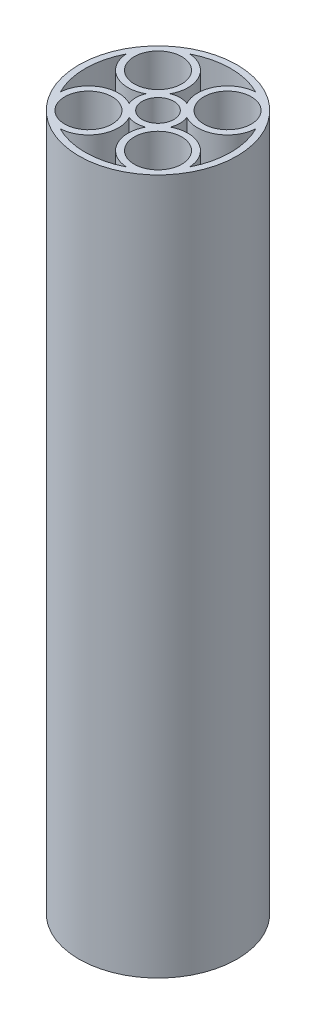
ISO-10303-21;
HEADER;
FILE_DESCRIPTION(('STEP AP214'),'2;1');
FILE_NAME('part.step','',(''),(''),'','','');
FILE_SCHEMA(('AUTOMOTIVE_DESIGN { 1 0 10303 214 1 1 1 1 }'));
ENDSEC;
DATA;
#1=APPLICATION_CONTEXT('core data for automotive mechanical design processes');
#2=APPLICATION_PROTOCOL_DEFINITION('international standard','automotive_design',2000,#1);
#3=PRODUCT_CONTEXT('',#1,'mechanical');
#4=PRODUCT('Part','Part','',(#3));
#5=PRODUCT_RELATED_PRODUCT_CATEGORY('part','',(#4));
#6=PRODUCT_DEFINITION_FORMATION('','',#4);
#7=PRODUCT_DEFINITION_CONTEXT('part definition',#1,'design');
#8=PRODUCT_DEFINITION('design','',#6,#7);
#9=PRODUCT_DEFINITION_SHAPE('','',#8);
#10=(LENGTH_UNIT() NAMED_UNIT(*) SI_UNIT(.MILLI.,.METRE.));
#11=(NAMED_UNIT(*) PLANE_ANGLE_UNIT() SI_UNIT($,.RADIAN.));
#12=(NAMED_UNIT(*) SI_UNIT($,.STERADIAN.) SOLID_ANGLE_UNIT());
#13=UNCERTAINTY_MEASURE_WITH_UNIT(LENGTH_MEASURE(1.E-05),#10,'distance_accuracy_value','');
#14=(GEOMETRIC_REPRESENTATION_CONTEXT(3) GLOBAL_UNCERTAINTY_ASSIGNED_CONTEXT((#13)) GLOBAL_UNIT_ASSIGNED_CONTEXT((#10,
#11,#12)) REPRESENTATION_CONTEXT('',''));
#15=CARTESIAN_POINT('',(0.,0.,0.));
#16=DIRECTION('',(0.,0.,1.));
#17=DIRECTION('',(1.,0.,0.));
#18=AXIS2_PLACEMENT_3D('',#15,#16,#17);
#19=CARTESIAN_POINT('',(0.,0.,0.));
#20=DIRECTION('',(0.,1.,0.));
#21=DIRECTION('',(0.,0.,1.));
#22=AXIS2_PLACEMENT_3D('',#19,#20,#21);
#23=PLANE('',#22);
#24=CARTESIAN_POINT('',(0.,0.,0.));
#25=DIRECTION('',(0.,1.,0.));
#26=DIRECTION('',(0.,0.,1.));
#27=AXIS2_PLACEMENT_3D('',#24,#25,#26);
#28=CIRCLE('',#27,115.);
#29=CARTESIAN_POINT('',(-52.2931012934667,0.,102.42280779744));
#30=VERTEX_POINT('',#29);
#31=CARTESIAN_POINT('',(52.293101293473,0.,102.422807797436));
#32=VERTEX_POINT('',#31);
#33=EDGE_CURVE('E209',#30,#32,#28,.T.);
#34=ORIENTED_EDGE('',*,*,#33,.F.);
#35=CARTESIAN_POINT('',(-54.9999999999967,0.,55.0000000000032));
#36=DIRECTION('',(0.,1.,0.));
#37=DIRECTION('',(0.,0.,1.));
#38=AXIS2_PLACEMENT_3D('',#35,#36,#37);
#39=CIRCLE('',#38,47.5);
#40=CARTESIAN_POINT('',(-13.2161546670079,0.,32.4088453329909));
#41=VERTEX_POINT('',#40);
#42=EDGE_CURVE('E188',#30,#41,#39,.T.);
#43=ORIENTED_EDGE('',*,*,#42,.T.);
#44=CARTESIAN_POINT('',(0.,0.,0.));
#45=DIRECTION('',(0.,1.,0.));
#46=DIRECTION('',(0.,0.,1.));
#47=AXIS2_PLACEMENT_3D('',#44,#45,#46);
#48=CIRCLE('',#47,35.);
#49=CARTESIAN_POINT('',(13.216154667014,0.,32.4088453329884));
#50=VERTEX_POINT('',#49);
#51=EDGE_CURVE('E59',#41,#50,#48,.T.);
#52=ORIENTED_EDGE('',*,*,#51,.T.);
#53=CARTESIAN_POINT('',(55.0000000000033,0.,54.9999999999999));
#54=DIRECTION('',(0.,1.,0.));
#55=DIRECTION('',(0.,0.,1.));
#56=AXIS2_PLACEMENT_3D('',#53,#54,#55);
#57=CIRCLE('',#56,47.5);
#58=EDGE_CURVE('E197',#50,#32,#57,.T.);
#59=ORIENTED_EDGE('',*,*,#58,.T.);
#60=EDGE_LOOP('',(#34,#43,#52,#59));
#61=FACE_BOUND('',#60,.T.);
#62=CARTESIAN_POINT('',(52.2931012934726,0.,-102.422807797436));
#63=VERTEX_POINT('',#62);
#64=CARTESIAN_POINT('',(-52.2931012934784,0.,-102.422807797434));
#65=VERTEX_POINT('',#64);
#66=EDGE_CURVE('E386',#63,#65,#28,.T.);
#67=ORIENTED_EDGE('',*,*,#66,.F.);
#68=CARTESIAN_POINT('',(55.,0.,-55.));
#69=DIRECTION('',(0.,1.,0.));
#70=DIRECTION('',(0.,0.,1.));
#71=AXIS2_PLACEMENT_3D('',#68,#69,#70);
#72=CIRCLE('',#71,47.5);
#73=CARTESIAN_POINT('',(13.2161546670099,0.,-32.4088453329901));
#74=VERTEX_POINT('',#73);
#75=EDGE_CURVE('E202',#63,#74,#72,.T.);
#76=ORIENTED_EDGE('',*,*,#75,.T.);
#77=CARTESIAN_POINT('',(-13.2161546670076,0.,-32.408845332991));
#78=VERTEX_POINT('',#77);
#79=EDGE_CURVE('E205',#74,#78,#48,.T.);
#80=ORIENTED_EDGE('',*,*,#79,.T.);
#81=CARTESIAN_POINT('',(-54.9999999999999,0.,-54.9999999999967));
#82=DIRECTION('',(0.,1.,0.));
#83=DIRECTION('',(0.,0.,1.));
#84=AXIS2_PLACEMENT_3D('',#81,#82,#83);
#85=CIRCLE('',#84,47.5);
#86=EDGE_CURVE('E176',#78,#65,#85,.T.);
#87=ORIENTED_EDGE('',*,*,#86,.T.);
#88=EDGE_LOOP('',(#67,#76,#80,#87));
#89=FACE_BOUND('',#88,.T.);
#90=CARTESIAN_POINT('',(-54.9999999999999,0.,-54.9999999999967));
#91=DIRECTION('',(0.,1.,0.));
#92=DIRECTION('',(0.,0.,1.));
#93=AXIS2_PLACEMENT_3D('',#90,#91,#92);
#94=CIRCLE('',#93,37.5);
#95=CARTESIAN_POINT('',(-54.9999999999999,0.,-17.4999999999967));
#96=VERTEX_POINT('',#95);
#97=EDGE_CURVE('E261',#96,#96,#94,.T.);
#98=ORIENTED_EDGE('',*,*,#97,.F.);
#99=EDGE_LOOP('',(#98));
#100=FACE_BOUND('',#99,.T.);
#101=CARTESIAN_POINT('',(-54.9999999999967,0.,55.0000000000032));
#102=DIRECTION('',(0.,1.,0.));
#103=DIRECTION('',(0.,0.,1.));
#104=AXIS2_PLACEMENT_3D('',#101,#102,#103);
#105=CIRCLE('',#104,37.5);
#106=CARTESIAN_POINT('',(-54.9999999999967,0.,92.5000000000032));
#107=VERTEX_POINT('',#106);
#108=EDGE_CURVE('E265',#107,#107,#105,.T.);
#109=ORIENTED_EDGE('',*,*,#108,.F.);
#110=EDGE_LOOP('',(#109));
#111=FACE_BOUND('',#110,.T.);
#112=CARTESIAN_POINT('',(55.0000000000033,0.,54.9999999999999));
#113=DIRECTION('',(0.,1.,0.));
#114=DIRECTION('',(0.,0.,1.));
#115=AXIS2_PLACEMENT_3D('',#112,#113,#114);
#116=CIRCLE('',#115,37.5);
#117=CARTESIAN_POINT('',(55.0000000000033,0.,92.4999999999999));
#118=VERTEX_POINT('',#117);
#119=EDGE_CURVE('E271',#118,#118,#116,.T.);
#120=ORIENTED_EDGE('',*,*,#119,.F.);
#121=EDGE_LOOP('',(#120));
#122=FACE_BOUND('',#121,.T.);
#123=CARTESIAN_POINT('',(0.,0.,0.));
#124=DIRECTION('',(0.,1.,0.));
#125=DIRECTION('',(0.,0.,1.));
#126=AXIS2_PLACEMENT_3D('',#123,#124,#125);
#127=CIRCLE('',#126,25.);
#128=CARTESIAN_POINT('',(0.,0.,25.));
#129=VERTEX_POINT('',#128);
#130=EDGE_CURVE('E277',#129,#129,#127,.T.);
#131=ORIENTED_EDGE('',*,*,#130,.F.);
#132=EDGE_LOOP('',(#131));
#133=FACE_BOUND('',#132,.T.);
#134=CARTESIAN_POINT('',(55.,0.,-55.));
#135=DIRECTION('',(0.,1.,0.));
#136=DIRECTION('',(0.,0.,1.));
#137=AXIS2_PLACEMENT_3D('',#134,#135,#136);
#138=CIRCLE('',#137,37.5);
#139=CARTESIAN_POINT('',(55.,0.,-17.5));
#140=VERTEX_POINT('',#139);
#141=EDGE_CURVE('E282',#140,#140,#138,.T.);
#142=ORIENTED_EDGE('',*,*,#141,.F.);
#143=EDGE_LOOP('',(#142));
#144=FACE_BOUND('',#143,.T.);
#145=CARTESIAN_POINT('',(0.,0.,0.));
#146=DIRECTION('',(0.,1.,0.));
#147=DIRECTION('',(0.,0.,1.));
#148=AXIS2_PLACEMENT_3D('',#145,#146,#147);
#149=CIRCLE('',#148,125.);
#150=CARTESIAN_POINT('',(0.,0.,125.));
#151=VERTEX_POINT('',#150);
#152=EDGE_CURVE('E11',#151,#151,#149,.T.);
#153=ORIENTED_EDGE('',*,*,#152,.T.);
#154=EDGE_LOOP('',(#153));
#155=FACE_BOUND('',#154,.T.);
#156=CARTESIAN_POINT('',(-102.422807797437,0.,-52.2931012934724));
#157=VERTEX_POINT('',#156);
#158=CARTESIAN_POINT('',(-102.422807797433,0.,52.2931012934788));
#159=VERTEX_POINT('',#158);
#160=EDGE_CURVE('E174',#157,#159,#28,.T.);
#161=ORIENTED_EDGE('',*,*,#160,.F.);
#162=CARTESIAN_POINT('',(-32.4088453329918,0.,-13.2161546670057));
#163=VERTEX_POINT('',#162);
#164=EDGE_CURVE('E154',#157,#163,#85,.T.);
#165=ORIENTED_EDGE('',*,*,#164,.T.);
#166=CARTESIAN_POINT('',(-32.4088453329893,0.,13.2161546670118));
#167=VERTEX_POINT('',#166);
#168=EDGE_CURVE('E163',#163,#167,#48,.T.);
#169=ORIENTED_EDGE('',*,*,#168,.T.);
#170=EDGE_CURVE('E187',#167,#159,#39,.T.);
#171=ORIENTED_EDGE('',*,*,#170,.T.);
#172=EDGE_LOOP('',(#161,#165,#169,#171));
#173=FACE_BOUND('',#172,.T.);
#174=CARTESIAN_POINT('',(102.422807797439,0.,52.2931012934668));
#175=VERTEX_POINT('',#174);
#176=CARTESIAN_POINT('',(102.422807797436,0.,-52.2931012934726));
#177=VERTEX_POINT('',#176);
#178=EDGE_CURVE('E384',#175,#177,#28,.T.);
#179=ORIENTED_EDGE('',*,*,#178,.F.);
#180=CARTESIAN_POINT('',(32.4088453329892,0.,13.2161546670121));
#181=VERTEX_POINT('',#180);
#182=EDGE_CURVE('E194',#175,#181,#57,.T.);
#183=ORIENTED_EDGE('',*,*,#182,.T.);
#184=CARTESIAN_POINT('',(32.4088453329901,0.,-13.2161546670099));
#185=VERTEX_POINT('',#184);
#186=EDGE_CURVE('E171',#181,#185,#48,.T.);
#187=ORIENTED_EDGE('',*,*,#186,.T.);
#188=EDGE_CURVE('E51',#185,#177,#72,.T.);
#189=ORIENTED_EDGE('',*,*,#188,.T.);
#190=EDGE_LOOP('',(#179,#183,#187,#189));
#191=FACE_BOUND('',#190,.T.);
#192=ADVANCED_FACE('F36',(#61,#89,#100,#111,#122,#133,#144,#155,#173,#191),#23,.T.);
#193=CARTESIAN_POINT('',(0.,-1050.,0.));
#194=DIRECTION('',(0.,1.,0.));
#195=DIRECTION('',(0.,0.,1.));
#196=AXIS2_PLACEMENT_3D('',#193,#194,#195);
#197=CYLINDRICAL_SURFACE('',#196,125.);
#198=ORIENTED_EDGE('',*,*,#152,.F.);
#199=EDGE_LOOP('',(#198));
#200=FACE_BOUND('',#199,.T.);
#201=CARTESIAN_POINT('',(0.,-1100.,0.));
#202=DIRECTION('',(0.,-1.,0.));
#203=DIRECTION('',(0.,0.,-1.));
#204=AXIS2_PLACEMENT_3D('',#201,#202,#203);
#205=CIRCLE('',#204,125.);
#206=CARTESIAN_POINT('',(0.,-1100.,-125.));
#207=VERTEX_POINT('',#206);
#208=EDGE_CURVE('E258',#207,#207,#205,.T.);
#209=ORIENTED_EDGE('',*,*,#208,.F.);
#210=EDGE_LOOP('',(#209));
#211=FACE_BOUND('',#210,.T.);
#212=ADVANCED_FACE('F38',(#200,#211),#197,.T.);
#213=CARTESIAN_POINT('',(55.,-1050.,-55.));
#214=DIRECTION('',(0.,1.,0.));
#215=DIRECTION('',(0.,0.,1.));
#216=AXIS2_PLACEMENT_3D('',#213,#214,#215);
#217=CYLINDRICAL_SURFACE('',#216,37.5);
#218=CARTESIAN_POINT('',(55.,-1050.,-55.));
#219=DIRECTION('',(0.,1.,0.));
#220=DIRECTION('',(0.,0.,1.));
#221=AXIS2_PLACEMENT_3D('',#218,#219,#220);
#222=CIRCLE('',#221,37.5);
#223=CARTESIAN_POINT('',(55.,-1050.,-17.5));
#224=VERTEX_POINT('',#223);
#225=EDGE_CURVE('E44',#224,#224,#222,.T.);
#226=ORIENTED_EDGE('',*,*,#225,.F.);
#227=EDGE_LOOP('',(#226));
#228=FACE_BOUND('',#227,.T.);
#229=ORIENTED_EDGE('',*,*,#141,.T.);
#230=EDGE_LOOP('',(#229));
#231=FACE_BOUND('',#230,.T.);
#232=ADVANCED_FACE('F287',(#228,#231),#217,.F.);
#233=CARTESIAN_POINT('',(0.,-1050.,0.));
#234=DIRECTION('',(0.,1.,0.));
#235=DIRECTION('',(0.,0.,1.));
#236=AXIS2_PLACEMENT_3D('',#233,#234,#235);
#237=CYLINDRICAL_SURFACE('',#236,25.);
#238=ORIENTED_EDGE('',*,*,#130,.T.);
#239=EDGE_LOOP('',(#238));
#240=FACE_BOUND('',#239,.T.);
#241=CARTESIAN_POINT('',(0.,-1100.,0.));
#242=DIRECTION('',(0.,-1.,0.));
#243=DIRECTION('',(0.,0.,-1.));
#244=AXIS2_PLACEMENT_3D('',#241,#242,#243);
#245=CIRCLE('',#244,25.);
#246=CARTESIAN_POINT('',(0.,-1100.,-25.));
#247=VERTEX_POINT('',#246);
#248=EDGE_CURVE('E255',#247,#247,#245,.T.);
#249=ORIENTED_EDGE('',*,*,#248,.T.);
#250=EDGE_LOOP('',(#249));
#251=FACE_BOUND('',#250,.T.);
#252=ADVANCED_FACE('F306',(#240,#251),#237,.F.);
#253=CARTESIAN_POINT('',(55.0000000000033,-1050.,54.9999999999999));
#254=DIRECTION('',(0.,1.,0.));
#255=DIRECTION('',(0.,0.,1.));
#256=AXIS2_PLACEMENT_3D('',#253,#254,#255);
#257=CYLINDRICAL_SURFACE('',#256,37.5);
#258=CARTESIAN_POINT('',(55.0000000000033,-1050.,54.9999999999999));
#259=DIRECTION('',(0.,1.,0.));
#260=DIRECTION('',(0.,0.,1.));
#261=AXIS2_PLACEMENT_3D('',#258,#259,#260);
#262=CIRCLE('',#261,37.5);
#263=CARTESIAN_POINT('',(55.0000000000033,-1050.,92.4999999999999));
#264=VERTEX_POINT('',#263);
#265=EDGE_CURVE('E274',#264,#264,#262,.T.);
#266=ORIENTED_EDGE('',*,*,#265,.F.);
#267=EDGE_LOOP('',(#266));
#268=FACE_BOUND('',#267,.T.);
#269=ORIENTED_EDGE('',*,*,#119,.T.);
#270=EDGE_LOOP('',(#269));
#271=FACE_BOUND('',#270,.T.);
#272=ADVANCED_FACE('F308',(#268,#271),#257,.F.);
#273=CARTESIAN_POINT('',(-54.9999999999967,-1050.,55.0000000000032));
#274=DIRECTION('',(0.,1.,0.));
#275=DIRECTION('',(0.,0.,1.));
#276=AXIS2_PLACEMENT_3D('',#273,#274,#275);
#277=CYLINDRICAL_SURFACE('',#276,37.5);
#278=CARTESIAN_POINT('',(-54.9999999999967,-1050.,55.0000000000032));
#279=DIRECTION('',(0.,1.,0.));
#280=DIRECTION('',(0.,0.,1.));
#281=AXIS2_PLACEMENT_3D('',#278,#279,#280);
#282=CIRCLE('',#281,37.5);
#283=CARTESIAN_POINT('',(-54.9999999999967,-1050.,92.5000000000032));
#284=VERTEX_POINT('',#283);
#285=EDGE_CURVE('E268',#284,#284,#282,.T.);
#286=ORIENTED_EDGE('',*,*,#285,.F.);
#287=EDGE_LOOP('',(#286));
#288=FACE_BOUND('',#287,.T.);
#289=ORIENTED_EDGE('',*,*,#108,.T.);
#290=EDGE_LOOP('',(#289));
#291=FACE_BOUND('',#290,.T.);
#292=ADVANCED_FACE('F315',(#288,#291),#277,.F.);
#293=CARTESIAN_POINT('',(-54.9999999999999,-1050.,-54.9999999999967));
#294=DIRECTION('',(0.,1.,0.));
#295=DIRECTION('',(0.,0.,1.));
#296=AXIS2_PLACEMENT_3D('',#293,#294,#295);
#297=CYLINDRICAL_SURFACE('',#296,37.5);
#298=CARTESIAN_POINT('',(-54.9999999999999,-1050.,-54.9999999999967));
#299=DIRECTION('',(0.,1.,0.));
#300=DIRECTION('',(0.,0.,1.));
#301=AXIS2_PLACEMENT_3D('',#298,#299,#300);
#302=CIRCLE('',#301,37.5);
#303=CARTESIAN_POINT('',(-54.9999999999999,-1050.,-17.4999999999967));
#304=VERTEX_POINT('',#303);
#305=EDGE_CURVE('E262',#304,#304,#302,.T.);
#306=ORIENTED_EDGE('',*,*,#305,.F.);
#307=EDGE_LOOP('',(#306));
#308=FACE_BOUND('',#307,.T.);
#309=ORIENTED_EDGE('',*,*,#97,.T.);
#310=EDGE_LOOP('',(#309));
#311=FACE_BOUND('',#310,.T.);
#312=ADVANCED_FACE('F323',(#308,#311),#297,.F.);
#313=CARTESIAN_POINT('',(0.,-1050.,0.));
#314=DIRECTION('',(0.,-1.,0.));
#315=DIRECTION('',(0.,0.,-1.));
#316=AXIS2_PLACEMENT_3D('',#313,#314,#315);
#317=PLANE('',#316);
#318=ORIENTED_EDGE('',*,*,#225,.T.);
#319=EDGE_LOOP('',(#318));
#320=FACE_BOUND('',#319,.T.);
#321=ADVANCED_FACE('F327',(#320),#317,.F.);
#322=ORIENTED_EDGE('',*,*,#265,.T.);
#323=EDGE_LOOP('',(#322));
#324=FACE_BOUND('',#323,.T.);
#325=ADVANCED_FACE('F525',(#324),#317,.F.);
#326=ORIENTED_EDGE('',*,*,#285,.T.);
#327=EDGE_LOOP('',(#326));
#328=FACE_BOUND('',#327,.T.);
#329=ADVANCED_FACE('F330',(#328),#317,.F.);
#330=ORIENTED_EDGE('',*,*,#305,.T.);
#331=EDGE_LOOP('',(#330));
#332=FACE_BOUND('',#331,.T.);
#333=ADVANCED_FACE('F302',(#332),#317,.F.);
#334=CARTESIAN_POINT('',(0.,-1100.,0.));
#335=DIRECTION('',(0.,-1.,0.));
#336=DIRECTION('',(0.,0.,-1.));
#337=AXIS2_PLACEMENT_3D('',#334,#335,#336);
#338=PLANE('',#337);
#339=ORIENTED_EDGE('',*,*,#208,.T.);
#340=EDGE_LOOP('',(#339));
#341=FACE_BOUND('',#340,.T.);
#342=ORIENTED_EDGE('',*,*,#248,.F.);
#343=EDGE_LOOP('',(#342));
#344=FACE_BOUND('',#343,.T.);
#345=ADVANCED_FACE('F298',(#341,#344),#338,.T.);
#346=CARTESIAN_POINT('',(0.,-1060.,0.));
#347=DIRECTION('',(0.,-1.,0.));
#348=DIRECTION('',(0.,0.,-1.));
#349=AXIS2_PLACEMENT_3D('',#346,#347,#348);
#350=PLANE('',#349);
#351=CARTESIAN_POINT('',(0.,-1060.,0.));
#352=DIRECTION('',(0.,-1.,0.));
#353=DIRECTION('',(0.,0.,-1.));
#354=AXIS2_PLACEMENT_3D('',#351,#352,#353);
#355=CIRCLE('',#354,35.);
#356=CARTESIAN_POINT('',(-32.4088453329893,-1060.,13.2161546670118));
#357=VERTEX_POINT('',#356);
#358=CARTESIAN_POINT('',(-13.2161546670079,-1060.,32.4088453329909));
#359=VERTEX_POINT('',#358);
#360=EDGE_CURVE('E252',#357,#359,#355,.F.);
#361=ORIENTED_EDGE('',*,*,#360,.T.);
#362=CARTESIAN_POINT('',(-54.9999999999967,-1060.,55.0000000000032));
#363=DIRECTION('',(0.,-1.,0.));
#364=DIRECTION('',(0.,0.,-1.));
#365=AXIS2_PLACEMENT_3D('',#362,#363,#364);
#366=CIRCLE('',#365,47.5);
#367=CARTESIAN_POINT('',(-52.2931012934666,-1060.,102.42280779744));
#368=VERTEX_POINT('',#367);
#369=EDGE_CURVE('E183',#368,#359,#366,.F.);
#370=ORIENTED_EDGE('',*,*,#369,.F.);
#371=CARTESIAN_POINT('',(0.,-1060.,0.));
#372=DIRECTION('',(0.,-1.,0.));
#373=DIRECTION('',(0.,0.,-1.));
#374=AXIS2_PLACEMENT_3D('',#371,#372,#373);
#375=CIRCLE('',#374,115.);
#376=CARTESIAN_POINT('',(-102.422807797433,-1060.,52.2931012934788));
#377=VERTEX_POINT('',#376);
#378=EDGE_CURVE('E244',#368,#377,#375,.T.);
#379=ORIENTED_EDGE('',*,*,#378,.T.);
#380=EDGE_CURVE('E186',#357,#377,#366,.F.);
#381=ORIENTED_EDGE('',*,*,#380,.F.);
#382=EDGE_LOOP('',(#361,#370,#379,#381));
#383=FACE_BOUND('',#382,.T.);
#384=ADVANCED_FACE('F301',(#383),#350,.T.);
#385=CARTESIAN_POINT('',(0.,-1060.,0.));
#386=DIRECTION('',(0.,-1.,0.));
#387=DIRECTION('',(0.,0.,-1.));
#388=AXIS2_PLACEMENT_3D('',#385,#386,#387);
#389=CIRCLE('',#388,35.);
#390=CARTESIAN_POINT('',(13.216154667014,-1060.,32.4088453329884));
#391=VERTEX_POINT('',#390);
#392=CARTESIAN_POINT('',(32.4088453329892,-1060.,13.2161546670121));
#393=VERTEX_POINT('',#392);
#394=EDGE_CURVE('E249',#391,#393,#389,.F.);
#395=ORIENTED_EDGE('',*,*,#394,.T.);
#396=CARTESIAN_POINT('',(55.0000000000033,-1060.,54.9999999999999));
#397=DIRECTION('',(0.,-1.,0.));
#398=DIRECTION('',(0.,0.,-1.));
#399=AXIS2_PLACEMENT_3D('',#396,#397,#398);
#400=CIRCLE('',#399,47.5);
#401=CARTESIAN_POINT('',(102.422807797439,-1060.,52.2931012934668));
#402=VERTEX_POINT('',#401);
#403=EDGE_CURVE('E169',#402,#393,#400,.F.);
#404=ORIENTED_EDGE('',*,*,#403,.F.);
#405=CARTESIAN_POINT('',(0.,-1060.,0.));
#406=DIRECTION('',(0.,-1.,0.));
#407=DIRECTION('',(0.,0.,-1.));
#408=AXIS2_PLACEMENT_3D('',#405,#406,#407);
#409=CIRCLE('',#408,115.);
#410=CARTESIAN_POINT('',(52.293101293473,-1060.,102.422807797436));
#411=VERTEX_POINT('',#410);
#412=EDGE_CURVE('E242',#402,#411,#409,.T.);
#413=ORIENTED_EDGE('',*,*,#412,.T.);
#414=EDGE_CURVE('E191',#391,#411,#400,.F.);
#415=ORIENTED_EDGE('',*,*,#414,.F.);
#416=EDGE_LOOP('',(#395,#404,#413,#415));
#417=FACE_BOUND('',#416,.T.);
#418=ADVANCED_FACE('F340',(#417),#350,.T.);
#419=CARTESIAN_POINT('',(0.,-1060.,0.));
#420=DIRECTION('',(0.,-1.,0.));
#421=DIRECTION('',(0.,0.,-1.));
#422=AXIS2_PLACEMENT_3D('',#419,#420,#421);
#423=CIRCLE('',#422,35.);
#424=CARTESIAN_POINT('',(32.4088453329901,-1060.,-13.2161546670099));
#425=VERTEX_POINT('',#424);
#426=CARTESIAN_POINT('',(13.2161546670099,-1060.,-32.4088453329901));
#427=VERTEX_POINT('',#426);
#428=EDGE_CURVE('E246',#425,#427,#423,.F.);
#429=ORIENTED_EDGE('',*,*,#428,.T.);
#430=CARTESIAN_POINT('',(55.,-1060.,-55.));
#431=DIRECTION('',(0.,-1.,0.));
#432=DIRECTION('',(0.,0.,-1.));
#433=AXIS2_PLACEMENT_3D('',#430,#431,#432);
#434=CIRCLE('',#433,47.5);
#435=CARTESIAN_POINT('',(52.2931012934726,-1060.,-102.422807797436));
#436=VERTEX_POINT('',#435);
#437=EDGE_CURVE('E198',#436,#427,#434,.F.);
#438=ORIENTED_EDGE('',*,*,#437,.F.);
#439=CARTESIAN_POINT('',(0.,-1060.,0.));
#440=DIRECTION('',(0.,-1.,0.));
#441=DIRECTION('',(0.,0.,-1.));
#442=AXIS2_PLACEMENT_3D('',#439,#440,#441);
#443=CIRCLE('',#442,115.);
#444=CARTESIAN_POINT('',(102.422807797436,-1060.,-52.2931012934726));
#445=VERTEX_POINT('',#444);
#446=EDGE_CURVE('E240',#436,#445,#443,.T.);
#447=ORIENTED_EDGE('',*,*,#446,.T.);
#448=EDGE_CURVE('E201',#425,#445,#434,.F.);
#449=ORIENTED_EDGE('',*,*,#448,.F.);
#450=EDGE_LOOP('',(#429,#438,#447,#449));
#451=FACE_BOUND('',#450,.T.);
#452=ADVANCED_FACE('F360',(#451),#350,.T.);
#453=CARTESIAN_POINT('',(0.,-1050.,0.));
#454=DIRECTION('',(0.,1.,0.));
#455=DIRECTION('',(0.,0.,1.));
#456=AXIS2_PLACEMENT_3D('',#453,#454,#455);
#457=CYLINDRICAL_SURFACE('',#456,35.);
#458=CARTESIAN_POINT('',(0.,-1090.,0.));
#459=DIRECTION('',(0.,-1.,0.));
#460=DIRECTION('',(0.,0.,-1.));
#461=AXIS2_PLACEMENT_3D('',#458,#459,#460);
#462=CIRCLE('',#461,35.);
#463=CARTESIAN_POINT('',(0.,-1090.,-35.));
#464=VERTEX_POINT('',#463);
#465=EDGE_CURVE('E616',#464,#464,#462,.T.);
#466=ORIENTED_EDGE('',*,*,#465,.F.);
#467=EDGE_LOOP('',(#466));
#468=FACE_BOUND('',#467,.T.);
#469=DIRECTION('',(0.,-1.,0.));
#470=VECTOR('',#469,1.);
#471=CARTESIAN_POINT('',(-32.4088453329893,-1050.,13.2161546670118));
#472=LINE('',#471,#470);
#473=EDGE_CURVE('E166',#167,#357,#472,.T.);
#474=ORIENTED_EDGE('',*,*,#473,.F.);
#475=ORIENTED_EDGE('',*,*,#168,.F.);
#476=DIRECTION('',(0.,-1.,0.));
#477=VECTOR('',#476,1.);
#478=CARTESIAN_POINT('',(-32.4088453329918,-1050.,-13.2161546670057));
#479=LINE('',#478,#477);
#480=CARTESIAN_POINT('',(-32.4088453329918,-1060.,-13.2161546670057));
#481=VERTEX_POINT('',#480);
#482=EDGE_CURVE('E150',#163,#481,#479,.T.);
#483=ORIENTED_EDGE('',*,*,#482,.T.);
#484=CARTESIAN_POINT('',(0.,-1060.,0.));
#485=DIRECTION('',(0.,-1.,0.));
#486=DIRECTION('',(0.,0.,-1.));
#487=AXIS2_PLACEMENT_3D('',#484,#485,#486);
#488=CIRCLE('',#487,35.);
#489=CARTESIAN_POINT('',(-13.2161546670076,-1060.,-32.408845332991));
#490=VERTEX_POINT('',#489);
#491=EDGE_CURVE('E238',#481,#490,#488,.T.);
#492=ORIENTED_EDGE('',*,*,#491,.T.);
#493=DIRECTION('',(0.,-1.,0.));
#494=VECTOR('',#493,1.);
#495=CARTESIAN_POINT('',(-13.2161546670076,-1050.,-32.408845332991));
#496=LINE('',#495,#494);
#497=EDGE_CURVE('E159',#78,#490,#496,.T.);
#498=ORIENTED_EDGE('',*,*,#497,.F.);
#499=ORIENTED_EDGE('',*,*,#79,.F.);
#500=DIRECTION('',(0.,-1.,0.));
#501=VECTOR('',#500,1.);
#502=CARTESIAN_POINT('',(13.2161546670099,-1050.,-32.4088453329901));
#503=LINE('',#502,#501);
#504=EDGE_CURVE('E211',#74,#427,#503,.T.);
#505=ORIENTED_EDGE('',*,*,#504,.T.);
#506=ORIENTED_EDGE('',*,*,#428,.F.);
#507=DIRECTION('',(0.,-1.,0.));
#508=VECTOR('',#507,1.);
#509=CARTESIAN_POINT('',(32.4088453329901,-1050.,-13.2161546670099));
#510=LINE('',#509,#508);
#511=EDGE_CURVE('E213',#185,#425,#510,.T.);
#512=ORIENTED_EDGE('',*,*,#511,.F.);
#513=ORIENTED_EDGE('',*,*,#186,.F.);
#514=DIRECTION('',(0.,-1.,0.));
#515=VECTOR('',#514,1.);
#516=CARTESIAN_POINT('',(32.4088453329892,-1050.,13.2161546670121));
#517=LINE('',#516,#515);
#518=EDGE_CURVE('E228',#181,#393,#517,.T.);
#519=ORIENTED_EDGE('',*,*,#518,.T.);
#520=ORIENTED_EDGE('',*,*,#394,.F.);
#521=DIRECTION('',(0.,-1.,0.));
#522=VECTOR('',#521,1.);
#523=CARTESIAN_POINT('',(13.216154667014,-1050.,32.4088453329884));
#524=LINE('',#523,#522);
#525=EDGE_CURVE('E226',#50,#391,#524,.T.);
#526=ORIENTED_EDGE('',*,*,#525,.F.);
#527=ORIENTED_EDGE('',*,*,#51,.F.);
#528=DIRECTION('',(0.,-1.,0.));
#529=VECTOR('',#528,1.);
#530=CARTESIAN_POINT('',(-13.2161546670079,-1050.,32.4088453329909));
#531=LINE('',#530,#529);
#532=EDGE_CURVE('E219',#41,#359,#531,.T.);
#533=ORIENTED_EDGE('',*,*,#532,.T.);
#534=ORIENTED_EDGE('',*,*,#360,.F.);
#535=EDGE_LOOP('',(#474,#475,#483,#492,#498,#499,#505,#506,#512,#513,#519,#520,#526,#527,#533,#534));
#536=FACE_BOUND('',#535,.T.);
#537=ADVANCED_FACE('F164',(#468,#536),#457,.T.);
#538=CARTESIAN_POINT('',(0.,-1050.,0.));
#539=DIRECTION('',(0.,1.,0.));
#540=DIRECTION('',(0.,0.,1.));
#541=AXIS2_PLACEMENT_3D('',#538,#539,#540);
#542=CYLINDRICAL_SURFACE('',#541,115.);
#543=CARTESIAN_POINT('',(0.,-1090.,0.));
#544=DIRECTION('',(0.,-1.,0.));
#545=DIRECTION('',(0.,0.,-1.));
#546=AXIS2_PLACEMENT_3D('',#543,#544,#545);
#547=CIRCLE('',#546,115.);
#548=CARTESIAN_POINT('',(0.,-1090.,-115.));
#549=VERTEX_POINT('',#548);
#550=EDGE_CURVE('E181',#549,#549,#547,.T.);
#551=ORIENTED_EDGE('',*,*,#550,.T.);
#552=EDGE_LOOP('',(#551));
#553=FACE_BOUND('',#552,.T.);
#554=DIRECTION('',(0.,1.,0.));
#555=VECTOR('',#554,1.);
#556=CARTESIAN_POINT('',(-52.2931012934666,-1050.,102.42280779744));
#557=LINE('',#556,#555);
#558=EDGE_CURVE('E232',#368,#30,#557,.T.);
#559=ORIENTED_EDGE('',*,*,#558,.T.);
#560=ORIENTED_EDGE('',*,*,#33,.T.);
#561=DIRECTION('',(0.,1.,0.));
#562=VECTOR('',#561,1.);
#563=CARTESIAN_POINT('',(52.293101293473,-1050.,102.422807797436));
#564=LINE('',#563,#562);
#565=EDGE_CURVE('E215',#411,#32,#564,.T.);
#566=ORIENTED_EDGE('',*,*,#565,.F.);
#567=ORIENTED_EDGE('',*,*,#412,.F.);
#568=DIRECTION('',(0.,1.,0.));
#569=VECTOR('',#568,1.);
#570=CARTESIAN_POINT('',(102.422807797439,-1050.,52.2931012934668));
#571=LINE('',#570,#569);
#572=EDGE_CURVE('E217',#402,#175,#571,.T.);
#573=ORIENTED_EDGE('',*,*,#572,.T.);
#574=ORIENTED_EDGE('',*,*,#178,.T.);
#575=DIRECTION('',(0.,1.,0.));
#576=VECTOR('',#575,1.);
#577=CARTESIAN_POINT('',(102.422807797436,-1050.,-52.2931012934726));
#578=LINE('',#577,#576);
#579=EDGE_CURVE('E222',#445,#177,#578,.T.);
#580=ORIENTED_EDGE('',*,*,#579,.F.);
#581=ORIENTED_EDGE('',*,*,#446,.F.);
#582=DIRECTION('',(0.,1.,0.));
#583=VECTOR('',#582,1.);
#584=CARTESIAN_POINT('',(52.2931012934726,-1050.,-102.422807797436));
#585=LINE('',#584,#583);
#586=EDGE_CURVE('E224',#436,#63,#585,.T.);
#587=ORIENTED_EDGE('',*,*,#586,.T.);
#588=ORIENTED_EDGE('',*,*,#66,.T.);
#589=DIRECTION('',(0.,1.,0.));
#590=VECTOR('',#589,1.);
#591=CARTESIAN_POINT('',(-52.2931012934784,-1050.,-102.422807797434));
#592=LINE('',#591,#590);
#593=CARTESIAN_POINT('',(-52.2931012934784,-1060.,-102.422807797434));
#594=VERTEX_POINT('',#593);
#595=EDGE_CURVE('E206',#594,#65,#592,.T.);
#596=ORIENTED_EDGE('',*,*,#595,.F.);
#597=CARTESIAN_POINT('',(0.,-1060.,0.));
#598=DIRECTION('',(0.,-1.,0.));
#599=DIRECTION('',(0.,0.,-1.));
#600=AXIS2_PLACEMENT_3D('',#597,#598,#599);
#601=CIRCLE('',#600,115.);
#602=CARTESIAN_POINT('',(-102.422807797437,-1060.,-52.2931012934725));
#603=VERTEX_POINT('',#602);
#604=EDGE_CURVE('E158',#594,#603,#601,.F.);
#605=ORIENTED_EDGE('',*,*,#604,.T.);
#606=DIRECTION('',(0.,1.,0.));
#607=VECTOR('',#606,1.);
#608=CARTESIAN_POINT('',(-102.422807797437,-1050.,-52.2931012934725));
#609=LINE('',#608,#607);
#610=EDGE_CURVE('E208',#603,#157,#609,.T.);
#611=ORIENTED_EDGE('',*,*,#610,.T.);
#612=ORIENTED_EDGE('',*,*,#160,.T.);
#613=DIRECTION('',(0.,1.,0.));
#614=VECTOR('',#613,1.);
#615=CARTESIAN_POINT('',(-102.422807797433,-1050.,52.2931012934788));
#616=LINE('',#615,#614);
#617=EDGE_CURVE('E230',#377,#159,#616,.T.);
#618=ORIENTED_EDGE('',*,*,#617,.F.);
#619=ORIENTED_EDGE('',*,*,#378,.F.);
#620=EDGE_LOOP('',(#559,#560,#566,#567,#573,#574,#580,#581,#587,#588,#596,#605,#611,#612,#618,#619));
#621=FACE_BOUND('',#620,.T.);
#622=ADVANCED_FACE('F359',(#553,#621),#542,.F.);
#623=CARTESIAN_POINT('',(-54.9999999999999,-1050.,-54.9999999999967));
#624=DIRECTION('',(0.,1.,0.));
#625=DIRECTION('',(0.,0.,1.));
#626=AXIS2_PLACEMENT_3D('',#623,#624,#625);
#627=CYLINDRICAL_SURFACE('',#626,47.5);
#628=ORIENTED_EDGE('',*,*,#164,.F.);
#629=ORIENTED_EDGE('',*,*,#610,.F.);
#630=CARTESIAN_POINT('',(-54.9999999999999,-1060.,-54.9999999999967));
#631=DIRECTION('',(0.,-1.,0.));
#632=DIRECTION('',(0.,0.,-1.));
#633=AXIS2_PLACEMENT_3D('',#630,#631,#632);
#634=CIRCLE('',#633,47.5);
#635=EDGE_CURVE('E157',#603,#481,#634,.F.);
#636=ORIENTED_EDGE('',*,*,#635,.T.);
#637=ORIENTED_EDGE('',*,*,#482,.F.);
#638=EDGE_LOOP('',(#628,#629,#636,#637));
#639=FACE_BOUND('',#638,.T.);
#640=ADVANCED_FACE('F152',(#639),#627,.T.);
#641=CARTESIAN_POINT('',(-54.9999999999967,-1050.,55.0000000000032));
#642=DIRECTION('',(0.,1.,0.));
#643=DIRECTION('',(0.,0.,1.));
#644=AXIS2_PLACEMENT_3D('',#641,#642,#643);
#645=CYLINDRICAL_SURFACE('',#644,47.5);
#646=ORIENTED_EDGE('',*,*,#369,.T.);
#647=ORIENTED_EDGE('',*,*,#532,.F.);
#648=ORIENTED_EDGE('',*,*,#42,.F.);
#649=ORIENTED_EDGE('',*,*,#558,.F.);
#650=EDGE_LOOP('',(#646,#647,#648,#649));
#651=FACE_BOUND('',#650,.T.);
#652=ADVANCED_FACE('F351',(#651),#645,.T.);
#653=CARTESIAN_POINT('',(55.0000000000033,-1050.,54.9999999999999));
#654=DIRECTION('',(0.,1.,0.));
#655=DIRECTION('',(0.,0.,1.));
#656=AXIS2_PLACEMENT_3D('',#653,#654,#655);
#657=CYLINDRICAL_SURFACE('',#656,47.5);
#658=ORIENTED_EDGE('',*,*,#182,.F.);
#659=ORIENTED_EDGE('',*,*,#572,.F.);
#660=ORIENTED_EDGE('',*,*,#403,.T.);
#661=ORIENTED_EDGE('',*,*,#518,.F.);
#662=EDGE_LOOP('',(#658,#659,#660,#661));
#663=FACE_BOUND('',#662,.T.);
#664=ADVANCED_FACE('F356',(#663),#657,.T.);
#665=CARTESIAN_POINT('',(55.,-1050.,-55.));
#666=DIRECTION('',(0.,1.,0.));
#667=DIRECTION('',(0.,0.,1.));
#668=AXIS2_PLACEMENT_3D('',#665,#666,#667);
#669=CYLINDRICAL_SURFACE('',#668,47.5);
#670=ORIENTED_EDGE('',*,*,#437,.T.);
#671=ORIENTED_EDGE('',*,*,#504,.F.);
#672=ORIENTED_EDGE('',*,*,#75,.F.);
#673=ORIENTED_EDGE('',*,*,#586,.F.);
#674=EDGE_LOOP('',(#670,#671,#672,#673));
#675=FACE_BOUND('',#674,.T.);
#676=ADVANCED_FACE('F364',(#675),#669,.T.);
#677=ORIENTED_EDGE('',*,*,#579,.T.);
#678=ORIENTED_EDGE('',*,*,#188,.F.);
#679=ORIENTED_EDGE('',*,*,#511,.T.);
#680=ORIENTED_EDGE('',*,*,#448,.T.);
#681=EDGE_LOOP('',(#677,#678,#679,#680));
#682=FACE_BOUND('',#681,.T.);
#683=ADVANCED_FACE('F354',(#682),#669,.T.);
#684=ORIENTED_EDGE('',*,*,#525,.T.);
#685=ORIENTED_EDGE('',*,*,#414,.T.);
#686=ORIENTED_EDGE('',*,*,#565,.T.);
#687=ORIENTED_EDGE('',*,*,#58,.F.);
#688=EDGE_LOOP('',(#684,#685,#686,#687));
#689=FACE_BOUND('',#688,.T.);
#690=ADVANCED_FACE('F349',(#689),#657,.T.);
#691=ORIENTED_EDGE('',*,*,#617,.T.);
#692=ORIENTED_EDGE('',*,*,#170,.F.);
#693=ORIENTED_EDGE('',*,*,#473,.T.);
#694=ORIENTED_EDGE('',*,*,#380,.T.);
#695=EDGE_LOOP('',(#691,#692,#693,#694));
#696=FACE_BOUND('',#695,.T.);
#697=ADVANCED_FACE('F345',(#696),#645,.T.);
#698=ORIENTED_EDGE('',*,*,#497,.T.);
#699=EDGE_CURVE('E175',#490,#594,#634,.F.);
#700=ORIENTED_EDGE('',*,*,#699,.T.);
#701=ORIENTED_EDGE('',*,*,#595,.T.);
#702=ORIENTED_EDGE('',*,*,#86,.F.);
#703=EDGE_LOOP('',(#698,#700,#701,#702));
#704=FACE_BOUND('',#703,.T.);
#705=ADVANCED_FACE('F342',(#704),#627,.T.);
#706=ORIENTED_EDGE('',*,*,#635,.F.);
#707=ORIENTED_EDGE('',*,*,#604,.F.);
#708=ORIENTED_EDGE('',*,*,#699,.F.);
#709=ORIENTED_EDGE('',*,*,#491,.F.);
#710=EDGE_LOOP('',(#706,#707,#708,#709));
#711=FACE_BOUND('',#710,.T.);
#712=ADVANCED_FACE('F336',(#711),#350,.T.);
#713=CARTESIAN_POINT('',(0.,-1090.,0.));
#714=DIRECTION('',(0.,-1.,0.));
#715=DIRECTION('',(0.,0.,-1.));
#716=AXIS2_PLACEMENT_3D('',#713,#714,#715);
#717=PLANE('',#716);
#718=ORIENTED_EDGE('',*,*,#550,.F.);
#719=EDGE_LOOP('',(#718));
#720=FACE_BOUND('',#719,.T.);
#721=ORIENTED_EDGE('',*,*,#465,.T.);
#722=EDGE_LOOP('',(#721));
#723=FACE_BOUND('',#722,.T.);
#724=ADVANCED_FACE('F333',(#720,#723),#717,.F.);
#725=CLOSED_SHELL('',(#192,#212,#232,#252,#272,#292,#312,#321,#325,#329,#333,#345,#384,#418,
#452,#537,#622,#640,#652,#664,#676,#683,#690,#697,#705,#712,#724));
#726=MANIFOLD_SOLID_BREP('B2',#725);
#727=ADVANCED_BREP_SHAPE_REPRESENTATION('',(#18,#726),#14);
#728=SHAPE_DEFINITION_REPRESENTATION(#9,#727);
ENDSEC;
END-ISO-10303-21;
